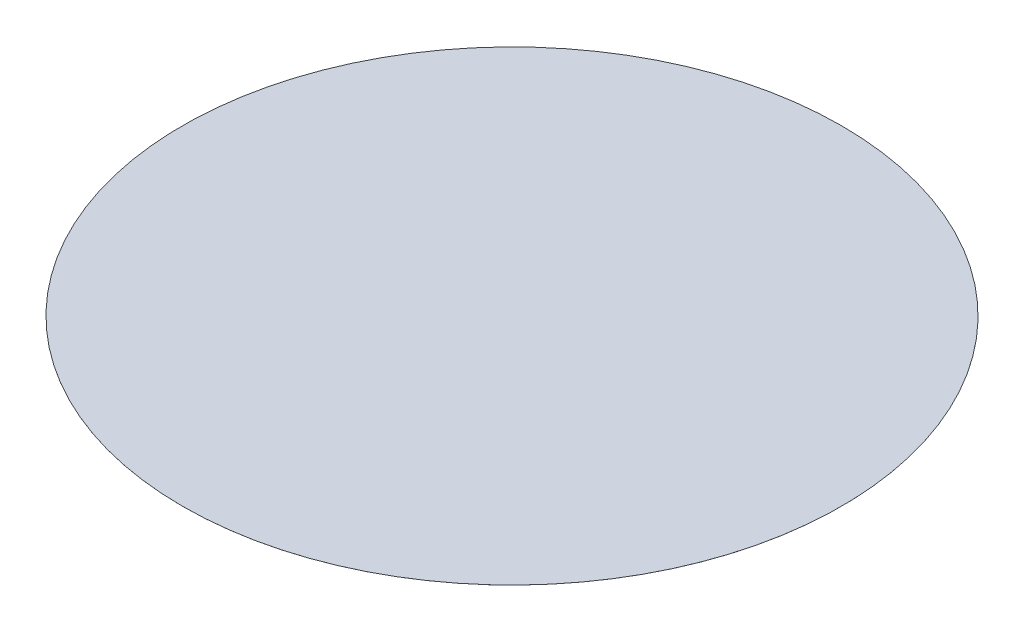
ISO-10303-21;
HEADER;
FILE_DESCRIPTION(('STEP AP214'),'2;1');
FILE_NAME('part.step','',(''),(''),'','','');
FILE_SCHEMA(('AUTOMOTIVE_DESIGN { 1 0 10303 214 1 1 1 1 }'));
ENDSEC;
DATA;
#1=APPLICATION_CONTEXT('core data for automotive mechanical design processes');
#2=APPLICATION_PROTOCOL_DEFINITION('international standard','automotive_design',2000,#1);
#3=PRODUCT_CONTEXT('',#1,'mechanical');
#4=PRODUCT('Part','Part','',(#3));
#5=PRODUCT_RELATED_PRODUCT_CATEGORY('part','',(#4));
#6=PRODUCT_DEFINITION_FORMATION('','',#4);
#7=PRODUCT_DEFINITION_CONTEXT('part definition',#1,'design');
#8=PRODUCT_DEFINITION('design','',#6,#7);
#9=PRODUCT_DEFINITION_SHAPE('','',#8);
#10=(LENGTH_UNIT() NAMED_UNIT(*) SI_UNIT(.MILLI.,.METRE.));
#11=(NAMED_UNIT(*) PLANE_ANGLE_UNIT() SI_UNIT($,.RADIAN.));
#12=(NAMED_UNIT(*) SI_UNIT($,.STERADIAN.) SOLID_ANGLE_UNIT());
#13=UNCERTAINTY_MEASURE_WITH_UNIT(LENGTH_MEASURE(1.E-05),#10,'distance_accuracy_value','');
#14=(GEOMETRIC_REPRESENTATION_CONTEXT(3) GLOBAL_UNCERTAINTY_ASSIGNED_CONTEXT((#13)) GLOBAL_UNIT_ASSIGNED_CONTEXT((#10,
#11,#12)) REPRESENTATION_CONTEXT('',''));
#15=CARTESIAN_POINT('',(0.,0.,0.));
#16=DIRECTION('',(0.,0.,1.));
#17=DIRECTION('',(1.,0.,0.));
#18=AXIS2_PLACEMENT_3D('',#15,#16,#17);
#19=CARTESIAN_POINT('',(0.,0.1,0.));
#20=DIRECTION('',(0.,-1.,0.));
#21=DIRECTION('',(0.,0.,-1.));
#22=AXIS2_PLACEMENT_3D('',#19,#20,#21);
#23=CYLINDRICAL_SURFACE('',#22,1418.);
#24=CARTESIAN_POINT('',(0.,0.1,0.));
#25=DIRECTION('',(0.,1.,0.));
#26=DIRECTION('',(0.,0.,1.));
#27=AXIS2_PLACEMENT_3D('',#24,#25,#26);
#28=CIRCLE('',#27,1418.);
#29=CARTESIAN_POINT('',(0.,0.1,1418.));
#30=VERTEX_POINT('',#29);
#31=EDGE_CURVE('E10',#30,#30,#28,.T.);
#32=ORIENTED_EDGE('',*,*,#31,.F.);
#33=EDGE_LOOP('',(#32));
#34=FACE_BOUND('',#33,.T.);
#35=CARTESIAN_POINT('',(0.,0.,0.));
#36=DIRECTION('',(0.,1.,0.));
#37=DIRECTION('',(0.,0.,1.));
#38=AXIS2_PLACEMENT_3D('',#35,#36,#37);
#39=CIRCLE('',#38,1418.);
#40=CARTESIAN_POINT('',(0.,0.,1418.));
#41=VERTEX_POINT('',#40);
#42=EDGE_CURVE('E33',#41,#41,#39,.T.);
#43=ORIENTED_EDGE('',*,*,#42,.T.);
#44=EDGE_LOOP('',(#43));
#45=FACE_BOUND('',#44,.T.);
#46=ADVANCED_FACE('F30',(#34,#45),#23,.T.);
#47=CARTESIAN_POINT('',(0.,0.1,0.));
#48=DIRECTION('',(0.,1.,0.));
#49=DIRECTION('',(0.,0.,1.));
#50=AXIS2_PLACEMENT_3D('',#47,#48,#49);
#51=PLANE('',#50);
#52=ORIENTED_EDGE('',*,*,#31,.T.);
#53=EDGE_LOOP('',(#52));
#54=FACE_BOUND('',#53,.T.);
#55=ADVANCED_FACE('F45',(#54),#51,.T.);
#56=CARTESIAN_POINT('',(0.,0.,0.));
#57=DIRECTION('',(0.,1.,0.));
#58=DIRECTION('',(0.,0.,1.));
#59=AXIS2_PLACEMENT_3D('',#56,#57,#58);
#60=PLANE('',#59);
#61=ORIENTED_EDGE('',*,*,#42,.F.);
#62=EDGE_LOOP('',(#61));
#63=FACE_BOUND('',#62,.T.);
#64=ADVANCED_FACE('F43',(#63),#60,.F.);
#65=CLOSED_SHELL('',(#46,#55,#64));
#66=MANIFOLD_SOLID_BREP('B2',#65);
#67=ADVANCED_BREP_SHAPE_REPRESENTATION('',(#18,#66),#14);
#68=SHAPE_DEFINITION_REPRESENTATION(#9,#67);
ENDSEC;
END-ISO-10303-21;
